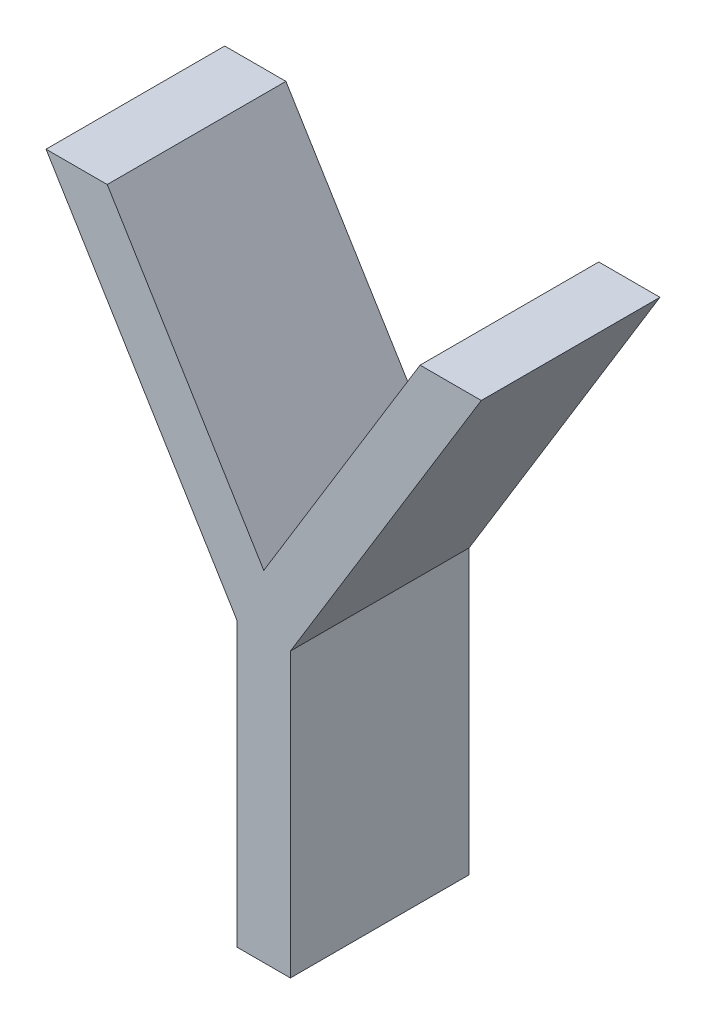
ISO-10303-21;
HEADER;
FILE_DESCRIPTION(('STEP AP214'),'2;1');
FILE_NAME('part.step','',(''),(''),'','','');
FILE_SCHEMA(('AUTOMOTIVE_DESIGN { 1 0 10303 214 1 1 1 1 }'));
ENDSEC;
DATA;
#1=APPLICATION_CONTEXT('core data for automotive mechanical design processes');
#2=APPLICATION_PROTOCOL_DEFINITION('international standard','automotive_design',2000,#1);
#3=PRODUCT_CONTEXT('',#1,'mechanical');
#4=PRODUCT('Part','Part','',(#3));
#5=PRODUCT_RELATED_PRODUCT_CATEGORY('part','',(#4));
#6=PRODUCT_DEFINITION_FORMATION('','',#4);
#7=PRODUCT_DEFINITION_CONTEXT('part definition',#1,'design');
#8=PRODUCT_DEFINITION('design','',#6,#7);
#9=PRODUCT_DEFINITION_SHAPE('','',#8);
#10=(LENGTH_UNIT() NAMED_UNIT(*) SI_UNIT(.MILLI.,.METRE.));
#11=(NAMED_UNIT(*) PLANE_ANGLE_UNIT() SI_UNIT($,.RADIAN.));
#12=(NAMED_UNIT(*) SI_UNIT($,.STERADIAN.) SOLID_ANGLE_UNIT());
#13=UNCERTAINTY_MEASURE_WITH_UNIT(LENGTH_MEASURE(1.E-05),#10,'distance_accuracy_value','');
#14=(GEOMETRIC_REPRESENTATION_CONTEXT(3) GLOBAL_UNCERTAINTY_ASSIGNED_CONTEXT((#13)) GLOBAL_UNIT_ASSIGNED_CONTEXT((#10,
#11,#12)) REPRESENTATION_CONTEXT('',''));
#15=CARTESIAN_POINT('',(0.,0.,0.));
#16=DIRECTION('',(0.,0.,1.));
#17=DIRECTION('',(1.,0.,0.));
#18=AXIS2_PLACEMENT_3D('',#15,#16,#17);
#19=CARTESIAN_POINT('',(-54.2184526875573,-20.4772058363114,1.5));
#20=DIRECTION('',(-0.853354313900652,-0.521331386880885,0.));
#21=DIRECTION('',(0.521331386880885,-0.853354313900652,0.));
#22=AXIS2_PLACEMENT_3D('',#19,#20,#21);
#23=PLANE('',#22);
#24=DIRECTION('',(-0.521331386880885,0.853354313900652,0.));
#25=VECTOR('',#24,1.);
#26=CARTESIAN_POINT('',(-54.2184526875573,-20.4772058363114,0.));
#27=LINE('',#26,#25);
#28=CARTESIAN_POINT('',(-54.2184526875573,-20.4772058363114,0.));
#29=VERTEX_POINT('',#28);
#30=CARTESIAN_POINT('',(-55.8210167901214,-17.8540087209268,0.));
#31=VERTEX_POINT('',#30);
#32=EDGE_CURVE('E136',#29,#31,#27,.T.);
#33=ORIENTED_EDGE('',*,*,#32,.F.);
#34=DIRECTION('',(0.,0.,-1.));
#35=VECTOR('',#34,1.);
#36=CARTESIAN_POINT('',(-54.2184526875573,-20.4772058363114,1.5));
#37=LINE('',#36,#35);
#38=CARTESIAN_POINT('',(-54.2184526875573,-20.4772058363114,1.5));
#39=VERTEX_POINT('',#38);
#40=EDGE_CURVE('E11',#39,#29,#37,.T.);
#41=ORIENTED_EDGE('',*,*,#40,.F.);
#42=DIRECTION('',(-0.521331386880885,0.853354313900652,0.));
#43=VECTOR('',#42,1.);
#44=CARTESIAN_POINT('',(-54.2184526875573,-20.4772058363114,1.5));
#45=LINE('',#44,#43);
#46=CARTESIAN_POINT('',(-55.8210167901214,-17.8540087209268,1.5));
#47=VERTEX_POINT('',#46);
#48=EDGE_CURVE('E159',#39,#47,#45,.T.);
#49=ORIENTED_EDGE('',*,*,#48,.T.);
#50=DIRECTION('',(0.,0.,-1.));
#51=VECTOR('',#50,1.);
#52=CARTESIAN_POINT('',(-55.8210167901214,-17.8540087209268,1.5));
#53=LINE('',#52,#51);
#54=EDGE_CURVE('E36',#47,#31,#53,.T.);
#55=ORIENTED_EDGE('',*,*,#54,.T.);
#56=EDGE_LOOP('',(#33,#41,#49,#55));
#57=FACE_BOUND('',#56,.T.);
#58=ADVANCED_FACE('F33',(#57),#23,.T.);
#59=CARTESIAN_POINT('',(-54.2184526875573,-22.8540087209268,1.5));
#60=DIRECTION('',(-1.,0.,0.));
#61=DIRECTION('',(0.,0.,1.));
#62=AXIS2_PLACEMENT_3D('',#59,#60,#61);
#63=PLANE('',#62);
#64=DIRECTION('',(0.,1.,0.));
#65=VECTOR('',#64,1.);
#66=CARTESIAN_POINT('',(-54.2184526875573,-22.8540087209268,0.));
#67=LINE('',#66,#65);
#68=CARTESIAN_POINT('',(-54.2184526875573,-22.8540087209268,0.));
#69=VERTEX_POINT('',#68);
#70=EDGE_CURVE('E157',#69,#29,#67,.T.);
#71=ORIENTED_EDGE('',*,*,#70,.F.);
#72=DIRECTION('',(0.,0.,-1.));
#73=VECTOR('',#72,1.);
#74=CARTESIAN_POINT('',(-54.2184526875573,-22.8540087209268,1.5));
#75=LINE('',#74,#73);
#76=CARTESIAN_POINT('',(-54.2184526875573,-22.8540087209268,1.5));
#77=VERTEX_POINT('',#76);
#78=EDGE_CURVE('E42',#77,#69,#75,.T.);
#79=ORIENTED_EDGE('',*,*,#78,.F.);
#80=DIRECTION('',(0.,1.,0.));
#81=VECTOR('',#80,1.);
#82=CARTESIAN_POINT('',(-54.2184526875573,-22.8540087209268,1.5));
#83=LINE('',#82,#81);
#84=EDGE_CURVE('E126',#77,#39,#83,.T.);
#85=ORIENTED_EDGE('',*,*,#84,.T.);
#86=ORIENTED_EDGE('',*,*,#40,.T.);
#87=EDGE_LOOP('',(#71,#79,#85,#86));
#88=FACE_BOUND('',#87,.T.);
#89=ADVANCED_FACE('F173',(#88),#63,.T.);
#90=CARTESIAN_POINT('',(-53.7697347388393,-22.8540087209268,1.5));
#91=DIRECTION('',(0.,-1.,0.));
#92=DIRECTION('',(0.,0.,-1.));
#93=AXIS2_PLACEMENT_3D('',#90,#91,#92);
#94=PLANE('',#93);
#95=DIRECTION('',(-1.,0.,0.));
#96=VECTOR('',#95,1.);
#97=CARTESIAN_POINT('',(-53.7697347388393,-22.8540087209268,0.));
#98=LINE('',#97,#96);
#99=CARTESIAN_POINT('',(-53.7697347388393,-22.8540087209268,0.));
#100=VERTEX_POINT('',#99);
#101=EDGE_CURVE('E113',#100,#69,#98,.T.);
#102=ORIENTED_EDGE('',*,*,#101,.F.);
#103=DIRECTION('',(0.,0.,-1.));
#104=VECTOR('',#103,1.);
#105=CARTESIAN_POINT('',(-53.7697347388393,-22.8540087209268,1.5));
#106=LINE('',#105,#104);
#107=CARTESIAN_POINT('',(-53.7697347388393,-22.8540087209268,1.5));
#108=VERTEX_POINT('',#107);
#109=EDGE_CURVE('E108',#108,#100,#106,.T.);
#110=ORIENTED_EDGE('',*,*,#109,.F.);
#111=DIRECTION('',(-1.,0.,0.));
#112=VECTOR('',#111,1.);
#113=CARTESIAN_POINT('',(-53.7697347388393,-22.8540087209268,1.5));
#114=LINE('',#113,#112);
#115=EDGE_CURVE('E111',#108,#77,#114,.T.);
#116=ORIENTED_EDGE('',*,*,#115,.T.);
#117=ORIENTED_EDGE('',*,*,#78,.T.);
#118=EDGE_LOOP('',(#102,#110,#116,#117));
#119=FACE_BOUND('',#118,.T.);
#120=ADVANCED_FACE('F110',(#119),#94,.T.);
#121=CARTESIAN_POINT('',(-53.7697347388393,-20.4772058363114,1.5));
#122=DIRECTION('',(1.,0.,0.));
#123=DIRECTION('',(0.,0.,-1.));
#124=AXIS2_PLACEMENT_3D('',#121,#122,#123);
#125=PLANE('',#124);
#126=DIRECTION('',(0.,-1.,0.));
#127=VECTOR('',#126,1.);
#128=CARTESIAN_POINT('',(-53.7697347388393,-20.4772058363114,0.));
#129=LINE('',#128,#127);
#130=CARTESIAN_POINT('',(-53.7697347388393,-20.4772058363114,0.));
#131=VERTEX_POINT('',#130);
#132=EDGE_CURVE('E154',#131,#100,#129,.T.);
#133=ORIENTED_EDGE('',*,*,#132,.F.);
#134=DIRECTION('',(0.,0.,-1.));
#135=VECTOR('',#134,1.);
#136=CARTESIAN_POINT('',(-53.7697347388393,-20.4772058363114,1.5));
#137=LINE('',#136,#135);
#138=CARTESIAN_POINT('',(-53.7697347388393,-20.4772058363114,1.5));
#139=VERTEX_POINT('',#138);
#140=EDGE_CURVE('E118',#139,#131,#137,.T.);
#141=ORIENTED_EDGE('',*,*,#140,.F.);
#142=DIRECTION('',(0.,-1.,0.));
#143=VECTOR('',#142,1.);
#144=CARTESIAN_POINT('',(-53.7697347388393,-20.4772058363114,1.5));
#145=LINE('',#144,#143);
#146=EDGE_CURVE('E124',#139,#108,#145,.T.);
#147=ORIENTED_EDGE('',*,*,#146,.T.);
#148=ORIENTED_EDGE('',*,*,#109,.T.);
#149=EDGE_LOOP('',(#133,#141,#147,#148));
#150=FACE_BOUND('',#149,.T.);
#151=ADVANCED_FACE('F128',(#150),#125,.T.);
#152=CARTESIAN_POINT('',(-52.1671706362752,-17.8540087209268,1.5));
#153=DIRECTION('',(0.853354313900651,-0.521331386880887,0.));
#154=DIRECTION('',(0.521331386880887,0.853354313900651,0.));
#155=AXIS2_PLACEMENT_3D('',#152,#153,#154);
#156=PLANE('',#155);
#157=DIRECTION('',(-0.521331386880887,-0.853354313900651,0.));
#158=VECTOR('',#157,1.);
#159=CARTESIAN_POINT('',(-52.1671706362752,-17.8540087209268,0.));
#160=LINE('',#159,#158);
#161=CARTESIAN_POINT('',(-52.1671706362752,-17.8540087209268,0.));
#162=VERTEX_POINT('',#161);
#163=EDGE_CURVE('E151',#162,#131,#160,.T.);
#164=ORIENTED_EDGE('',*,*,#163,.F.);
#165=DIRECTION('',(0.,0.,-1.));
#166=VECTOR('',#165,1.);
#167=CARTESIAN_POINT('',(-52.1671706362752,-17.8540087209268,1.5));
#168=LINE('',#167,#166);
#169=CARTESIAN_POINT('',(-52.1671706362752,-17.8540087209268,1.5));
#170=VERTEX_POINT('',#169);
#171=EDGE_CURVE('E163',#170,#162,#168,.T.);
#172=ORIENTED_EDGE('',*,*,#171,.F.);
#173=DIRECTION('',(-0.521331386880887,-0.853354313900651,0.));
#174=VECTOR('',#173,1.);
#175=CARTESIAN_POINT('',(-52.1671706362752,-17.8540087209268,1.5));
#176=LINE('',#175,#174);
#177=EDGE_CURVE('E129',#170,#139,#176,.T.);
#178=ORIENTED_EDGE('',*,*,#177,.T.);
#179=ORIENTED_EDGE('',*,*,#140,.T.);
#180=EDGE_LOOP('',(#164,#172,#178,#179));
#181=FACE_BOUND('',#180,.T.);
#182=ADVANCED_FACE('F186',(#181),#156,.T.);
#183=CARTESIAN_POINT('',(-52.6809927516598,-17.8540087209268,1.5));
#184=DIRECTION('',(0.,1.,0.));
#185=DIRECTION('',(0.,0.,1.));
#186=AXIS2_PLACEMENT_3D('',#183,#184,#185);
#187=PLANE('',#186);
#188=DIRECTION('',(1.,0.,0.));
#189=VECTOR('',#188,1.);
#190=CARTESIAN_POINT('',(-52.6809927516598,-17.8540087209268,0.));
#191=LINE('',#190,#189);
#192=CARTESIAN_POINT('',(-52.6809927516598,-17.8540087209268,0.));
#193=VERTEX_POINT('',#192);
#194=EDGE_CURVE('E148',#193,#162,#191,.T.);
#195=ORIENTED_EDGE('',*,*,#194,.F.);
#196=DIRECTION('',(0.,0.,-1.));
#197=VECTOR('',#196,1.);
#198=CARTESIAN_POINT('',(-52.6809927516598,-17.8540087209268,1.5));
#199=LINE('',#198,#197);
#200=CARTESIAN_POINT('',(-52.6809927516598,-17.8540087209268,1.5));
#201=VERTEX_POINT('',#200);
#202=EDGE_CURVE('E165',#201,#193,#199,.T.);
#203=ORIENTED_EDGE('',*,*,#202,.F.);
#204=DIRECTION('',(1.,0.,0.));
#205=VECTOR('',#204,1.);
#206=CARTESIAN_POINT('',(-52.6809927516598,-17.8540087209268,1.5));
#207=LINE('',#206,#205);
#208=EDGE_CURVE('E131',#201,#170,#207,.T.);
#209=ORIENTED_EDGE('',*,*,#208,.T.);
#210=ORIENTED_EDGE('',*,*,#171,.T.);
#211=EDGE_LOOP('',(#195,#203,#209,#210));
#212=FACE_BOUND('',#211,.T.);
#213=ADVANCED_FACE('F189',(#212),#187,.T.);
#214=CARTESIAN_POINT('',(-53.9930921106342,-20.0024462209268,1.5));
#215=DIRECTION('',(-0.853429324019757,0.52120858483258,0.));
#216=DIRECTION('',(-0.52120858483258,-0.853429324019757,0.));
#217=AXIS2_PLACEMENT_3D('',#214,#215,#216);
#218=PLANE('',#217);
#219=DIRECTION('',(0.52120858483258,0.853429324019757,0.));
#220=VECTOR('',#219,1.);
#221=CARTESIAN_POINT('',(-53.9930921106342,-20.0024462209268,0.));
#222=LINE('',#221,#220);
#223=CARTESIAN_POINT('',(-53.9930921106342,-20.0024462209268,0.));
#224=VERTEX_POINT('',#223);
#225=EDGE_CURVE('E145',#224,#193,#222,.T.);
#226=ORIENTED_EDGE('',*,*,#225,.F.);
#227=DIRECTION('',(0.,0.,-1.));
#228=VECTOR('',#227,1.);
#229=CARTESIAN_POINT('',(-53.9930921106342,-20.0024462209268,1.5));
#230=LINE('',#229,#228);
#231=CARTESIAN_POINT('',(-53.9930921106342,-20.0024462209268,1.5));
#232=VERTEX_POINT('',#231);
#233=EDGE_CURVE('E167',#232,#224,#230,.T.);
#234=ORIENTED_EDGE('',*,*,#233,.F.);
#235=DIRECTION('',(0.52120858483258,0.853429324019757,0.));
#236=VECTOR('',#235,1.);
#237=CARTESIAN_POINT('',(-53.9930921106342,-20.0024462209268,1.5));
#238=LINE('',#237,#236);
#239=EDGE_CURVE('E310',#232,#201,#238,.T.);
#240=ORIENTED_EDGE('',*,*,#239,.T.);
#241=ORIENTED_EDGE('',*,*,#202,.T.);
#242=EDGE_LOOP('',(#226,#234,#240,#241));
#243=FACE_BOUND('',#242,.T.);
#244=ADVANCED_FACE('F193',(#243),#218,.T.);
#245=CARTESIAN_POINT('',(-55.3071946747368,-17.8540087209268,1.5));
#246=DIRECTION('',(0.853075318126462,0.521787793651246,0.));
#247=DIRECTION('',(-0.521787793651246,0.853075318126463,0.));
#248=AXIS2_PLACEMENT_3D('',#245,#246,#247);
#249=PLANE('',#248);
#250=DIRECTION('',(0.521787793651246,-0.853075318126462,0.));
#251=VECTOR('',#250,1.);
#252=CARTESIAN_POINT('',(-55.3071946747368,-17.8540087209268,0.));
#253=LINE('',#252,#251);
#254=CARTESIAN_POINT('',(-55.3071946747368,-17.8540087209268,0.));
#255=VERTEX_POINT('',#254);
#256=EDGE_CURVE('E142',#255,#224,#253,.T.);
#257=ORIENTED_EDGE('',*,*,#256,.F.);
#258=DIRECTION('',(0.,0.,-1.));
#259=VECTOR('',#258,1.);
#260=CARTESIAN_POINT('',(-55.3071946747368,-17.8540087209268,1.5));
#261=LINE('',#260,#259);
#262=CARTESIAN_POINT('',(-55.3071946747368,-17.8540087209268,1.5));
#263=VERTEX_POINT('',#262);
#264=EDGE_CURVE('E168',#263,#255,#261,.T.);
#265=ORIENTED_EDGE('',*,*,#264,.F.);
#266=DIRECTION('',(0.521787793651246,-0.853075318126462,0.));
#267=VECTOR('',#266,1.);
#268=CARTESIAN_POINT('',(-55.3071946747368,-17.8540087209268,1.5));
#269=LINE('',#268,#267);
#270=EDGE_CURVE('E314',#263,#232,#269,.T.);
#271=ORIENTED_EDGE('',*,*,#270,.T.);
#272=ORIENTED_EDGE('',*,*,#233,.T.);
#273=EDGE_LOOP('',(#257,#265,#271,#272));
#274=FACE_BOUND('',#273,.T.);
#275=ADVANCED_FACE('F197',(#274),#249,.T.);
#276=CARTESIAN_POINT('',(-55.8210167901214,-17.8540087209268,1.5));
#277=DIRECTION('',(0.,1.,0.));
#278=DIRECTION('',(0.,0.,1.));
#279=AXIS2_PLACEMENT_3D('',#276,#277,#278);
#280=PLANE('',#279);
#281=DIRECTION('',(1.,0.,0.));
#282=VECTOR('',#281,1.);
#283=CARTESIAN_POINT('',(-55.8210167901214,-17.8540087209268,0.));
#284=LINE('',#283,#282);
#285=EDGE_CURVE('E139',#31,#255,#284,.T.);
#286=ORIENTED_EDGE('',*,*,#285,.F.);
#287=ORIENTED_EDGE('',*,*,#54,.F.);
#288=DIRECTION('',(1.,0.,0.));
#289=VECTOR('',#288,1.);
#290=CARTESIAN_POINT('',(-55.8210167901214,-17.8540087209268,1.5));
#291=LINE('',#290,#289);
#292=EDGE_CURVE('E318',#47,#263,#291,.T.);
#293=ORIENTED_EDGE('',*,*,#292,.T.);
#294=ORIENTED_EDGE('',*,*,#264,.T.);
#295=EDGE_LOOP('',(#286,#287,#293,#294));
#296=FACE_BOUND('',#295,.T.);
#297=ADVANCED_FACE('F170',(#296),#280,.T.);
#298=CARTESIAN_POINT('',(0.,0.,1.5));
#299=DIRECTION('',(0.,0.,1.));
#300=DIRECTION('',(1.,0.,0.));
#301=AXIS2_PLACEMENT_3D('',#298,#299,#300);
#302=PLANE('',#301);
#303=ORIENTED_EDGE('',*,*,#48,.F.);
#304=ORIENTED_EDGE('',*,*,#84,.F.);
#305=ORIENTED_EDGE('',*,*,#115,.F.);
#306=ORIENTED_EDGE('',*,*,#146,.F.);
#307=ORIENTED_EDGE('',*,*,#177,.F.);
#308=ORIENTED_EDGE('',*,*,#208,.F.);
#309=ORIENTED_EDGE('',*,*,#239,.F.);
#310=ORIENTED_EDGE('',*,*,#270,.F.);
#311=ORIENTED_EDGE('',*,*,#292,.F.);
#312=EDGE_LOOP('',(#303,#304,#305,#306,#307,#308,#309,#310,#311));
#313=FACE_BOUND('',#312,.T.);
#314=ADVANCED_FACE('F122',(#313),#302,.T.);
#315=CARTESIAN_POINT('',(0.,0.,0.));
#316=DIRECTION('',(0.,0.,1.));
#317=DIRECTION('',(1.,0.,0.));
#318=AXIS2_PLACEMENT_3D('',#315,#316,#317);
#319=PLANE('',#318);
#320=ORIENTED_EDGE('',*,*,#32,.T.);
#321=ORIENTED_EDGE('',*,*,#285,.T.);
#322=ORIENTED_EDGE('',*,*,#256,.T.);
#323=ORIENTED_EDGE('',*,*,#225,.T.);
#324=ORIENTED_EDGE('',*,*,#194,.T.);
#325=ORIENTED_EDGE('',*,*,#163,.T.);
#326=ORIENTED_EDGE('',*,*,#132,.T.);
#327=ORIENTED_EDGE('',*,*,#101,.T.);
#328=ORIENTED_EDGE('',*,*,#70,.T.);
#329=EDGE_LOOP('',(#320,#321,#322,#323,#324,#325,#326,#327,#328));
#330=FACE_BOUND('',#329,.T.);
#331=ADVANCED_FACE('F172',(#330),#319,.F.);
#332=CLOSED_SHELL('',(#58,#89,#120,#151,#182,#213,#244,#275,#297,#314,#331));
#333=MANIFOLD_SOLID_BREP('B2',#332);
#334=ADVANCED_BREP_SHAPE_REPRESENTATION('',(#18,#333),#14);
#335=SHAPE_DEFINITION_REPRESENTATION(#9,#334);
ENDSEC;
END-ISO-10303-21;
